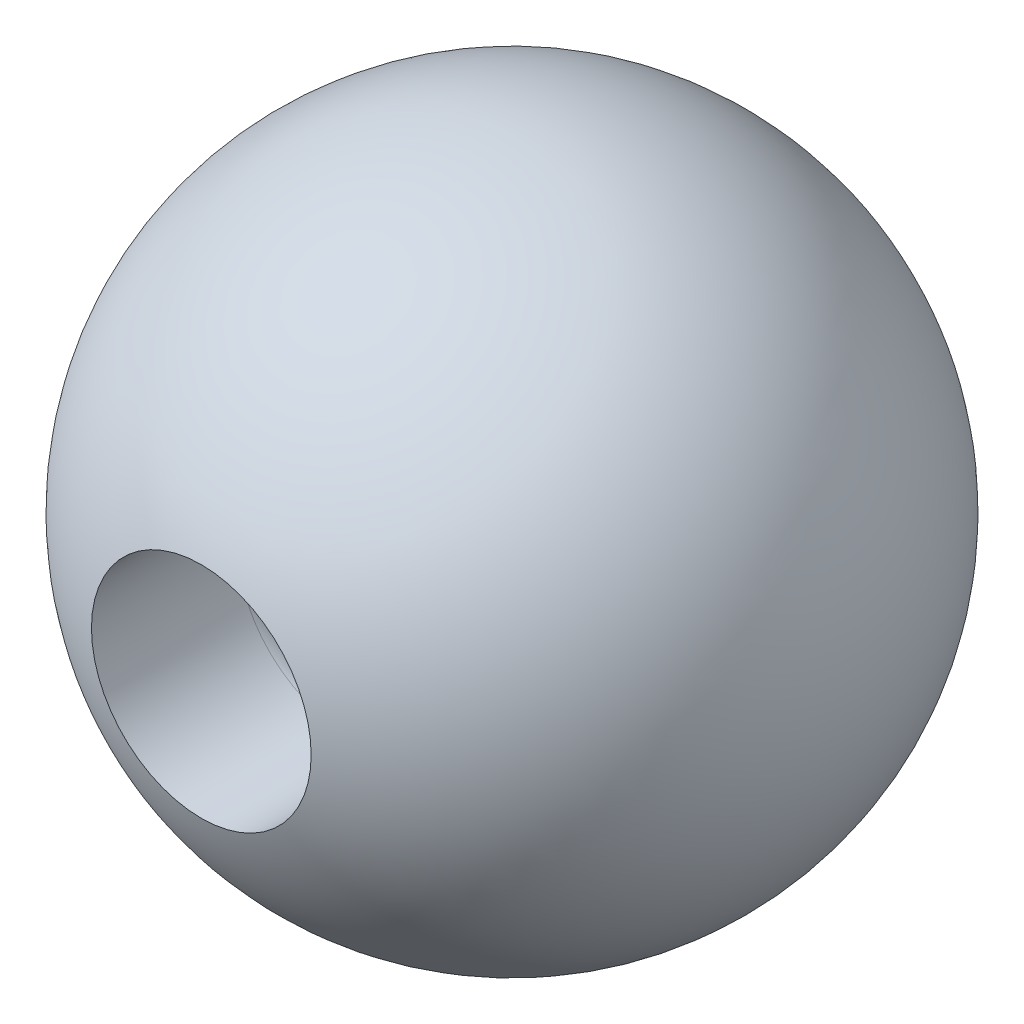
ISO-10303-21;
HEADER;
FILE_DESCRIPTION(('STEP AP214'),'2;1');
FILE_NAME('part.step','',(''),(''),'','','');
FILE_SCHEMA(('AUTOMOTIVE_DESIGN { 1 0 10303 214 1 1 1 1 }'));
ENDSEC;
DATA;
#1=APPLICATION_CONTEXT('core data for automotive mechanical design processes');
#2=APPLICATION_PROTOCOL_DEFINITION('international standard','automotive_design',2000,#1);
#3=PRODUCT_CONTEXT('',#1,'mechanical');
#4=PRODUCT('Part','Part','',(#3));
#5=PRODUCT_RELATED_PRODUCT_CATEGORY('part','',(#4));
#6=PRODUCT_DEFINITION_FORMATION('','',#4);
#7=PRODUCT_DEFINITION_CONTEXT('part definition',#1,'design');
#8=PRODUCT_DEFINITION('design','',#6,#7);
#9=PRODUCT_DEFINITION_SHAPE('','',#8);
#10=(LENGTH_UNIT() NAMED_UNIT(*) SI_UNIT(.MILLI.,.METRE.));
#11=(NAMED_UNIT(*) PLANE_ANGLE_UNIT() SI_UNIT($,.RADIAN.));
#12=(NAMED_UNIT(*) SI_UNIT($,.STERADIAN.) SOLID_ANGLE_UNIT());
#13=UNCERTAINTY_MEASURE_WITH_UNIT(LENGTH_MEASURE(1.E-05),#10,'distance_accuracy_value','');
#14=(GEOMETRIC_REPRESENTATION_CONTEXT(3) GLOBAL_UNCERTAINTY_ASSIGNED_CONTEXT((#13)) GLOBAL_UNIT_ASSIGNED_CONTEXT((#10,
#11,#12)) REPRESENTATION_CONTEXT('',''));
#15=CARTESIAN_POINT('',(0.,0.,0.));
#16=DIRECTION('',(0.,0.,1.));
#17=DIRECTION('',(1.,0.,0.));
#18=AXIS2_PLACEMENT_3D('',#15,#16,#17);
#19=CARTESIAN_POINT('',(0.,0.,-1.5));
#20=DIRECTION('',(0.,0.,-1.));
#21=DIRECTION('',(1.,0.,0.));
#22=AXIS2_PLACEMENT_3D('',#19,#20,#21);
#23=SPHERICAL_SURFACE('',#22,1.5);
#24=CARTESIAN_POINT('',(0.,0.,-0.0857864376269052));
#25=DIRECTION('',(0.,0.,-1.));
#26=DIRECTION('',(-1.,0.,0.));
#27=AXIS2_PLACEMENT_3D('',#24,#25,#26);
#28=CIRCLE('',#27,0.5);
#29=CARTESIAN_POINT('',(-0.5,0.,-0.0857864376269052));
#30=VERTEX_POINT('',#29);
#31=EDGE_CURVE('E55',#30,#30,#28,.T.);
#32=ORIENTED_EDGE('',*,*,#31,.T.);
#33=EDGE_LOOP('',(#32));
#34=FACE_BOUND('',#33,.T.);
#35=ADVANCED_FACE('F41',(#34),#23,.T.);
#36=CARTESIAN_POINT('',(0.,0.,-4.26888756357686));
#37=DIRECTION('',(0.,0.,-1.));
#38=DIRECTION('',(-1.,0.,0.));
#39=AXIS2_PLACEMENT_3D('',#36,#37,#38);
#40=CYLINDRICAL_SURFACE('',#39,0.5);
#41=CARTESIAN_POINT('',(0.,0.,-0.75));
#42=DIRECTION('',(0.,0.,1.));
#43=DIRECTION('',(1.,0.,0.));
#44=AXIS2_PLACEMENT_3D('',#41,#42,#43);
#45=CIRCLE('',#44,0.5);
#46=CARTESIAN_POINT('',(0.5,0.,-0.75));
#47=VERTEX_POINT('',#46);
#48=EDGE_CURVE('E49',#47,#47,#45,.F.);
#49=ORIENTED_EDGE('',*,*,#48,.T.);
#50=EDGE_LOOP('',(#49));
#51=FACE_BOUND('',#50,.T.);
#52=ORIENTED_EDGE('',*,*,#31,.F.);
#53=EDGE_LOOP('',(#52));
#54=FACE_BOUND('',#53,.T.);
#55=ADVANCED_FACE('F76',(#51,#54),#40,.F.);
#56=CARTESIAN_POINT('',(0.,0.,-1.));
#57=DIRECTION('',(0.,0.,1.));
#58=DIRECTION('',(1.,0.,0.));
#59=AXIS2_PLACEMENT_3D('',#56,#57,#58);
#60=PLANE('',#59);
#61=CARTESIAN_POINT('',(0.,0.,-1.));
#62=DIRECTION('',(0.,0.,1.));
#63=DIRECTION('',(1.,0.,0.));
#64=AXIS2_PLACEMENT_3D('',#61,#62,#63);
#65=CIRCLE('',#64,0.75);
#66=CARTESIAN_POINT('',(0.75,0.,-1.));
#67=VERTEX_POINT('',#66);
#68=EDGE_CURVE('E10',#67,#67,#65,.T.);
#69=ORIENTED_EDGE('',*,*,#68,.T.);
#70=EDGE_LOOP('',(#69));
#71=FACE_BOUND('',#70,.T.);
#72=CARTESIAN_POINT('',(0.,0.,-1.));
#73=DIRECTION('',(0.,0.,1.));
#74=DIRECTION('',(1.,0.,0.));
#75=AXIS2_PLACEMENT_3D('',#72,#73,#74);
#76=CIRCLE('',#75,0.866025403784439);
#77=CARTESIAN_POINT('',(0.866025403784439,0.,-1.));
#78=VERTEX_POINT('',#77);
#79=EDGE_CURVE('E60',#78,#78,#76,.F.);
#80=ORIENTED_EDGE('',*,*,#79,.T.);
#81=EDGE_LOOP('',(#80));
#82=FACE_BOUND('',#81,.T.);
#83=ADVANCED_FACE('F66',(#71,#82),#60,.F.);
#84=CARTESIAN_POINT('',(0.,0.,-1.5));
#85=DIRECTION('',(0.,0.,-1.));
#86=DIRECTION('',(1.,0.,0.));
#87=AXIS2_PLACEMENT_3D('',#84,#85,#86);
#88=SPHERICAL_SURFACE('',#87,1.);
#89=ORIENTED_EDGE('',*,*,#79,.F.);
#90=EDGE_LOOP('',(#89));
#91=FACE_BOUND('',#90,.T.);
#92=ADVANCED_FACE('F68',(#91),#88,.F.);
#93=CARTESIAN_POINT('',(0.,0.,-0.75));
#94=DIRECTION('',(0.,0.,1.));
#95=DIRECTION('',(1.,0.,0.));
#96=AXIS2_PLACEMENT_3D('',#93,#94,#95);
#97=TOROIDAL_SURFACE('',#96,0.75,0.25);
#98=ORIENTED_EDGE('',*,*,#68,.F.);
#99=EDGE_LOOP('',(#98));
#100=FACE_BOUND('',#99,.T.);
#101=ORIENTED_EDGE('',*,*,#48,.F.);
#102=EDGE_LOOP('',(#101));
#103=FACE_BOUND('',#102,.T.);
#104=ADVANCED_FACE('F43',(#100,#103),#97,.T.);
#105=CLOSED_SHELL('',(#35,#55,#83,#92,#104));
#106=MANIFOLD_SOLID_BREP('B2',#105);
#107=ADVANCED_BREP_SHAPE_REPRESENTATION('',(#18,#106),#14);
#108=SHAPE_DEFINITION_REPRESENTATION(#9,#107);
ENDSEC;
END-ISO-10303-21;
